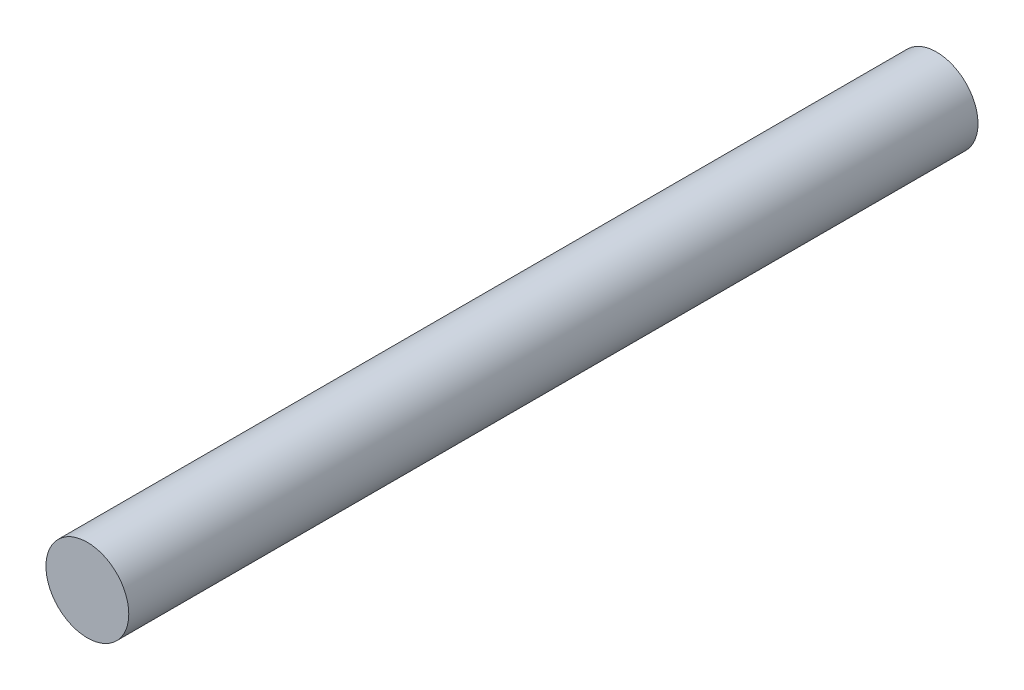
ISO-10303-21;
HEADER;
FILE_DESCRIPTION(('STEP AP214'),'2;1');
FILE_NAME('part.step','',(''),(''),'','','');
FILE_SCHEMA(('AUTOMOTIVE_DESIGN { 1 0 10303 214 1 1 1 1 }'));
ENDSEC;
DATA;
#1=APPLICATION_CONTEXT('core data for automotive mechanical design processes');
#2=APPLICATION_PROTOCOL_DEFINITION('international standard','automotive_design',2000,#1);
#3=PRODUCT_CONTEXT('',#1,'mechanical');
#4=PRODUCT('Part','Part','',(#3));
#5=PRODUCT_RELATED_PRODUCT_CATEGORY('part','',(#4));
#6=PRODUCT_DEFINITION_FORMATION('','',#4);
#7=PRODUCT_DEFINITION_CONTEXT('part definition',#1,'design');
#8=PRODUCT_DEFINITION('design','',#6,#7);
#9=PRODUCT_DEFINITION_SHAPE('','',#8);
#10=(LENGTH_UNIT() NAMED_UNIT(*) SI_UNIT(.MILLI.,.METRE.));
#11=(NAMED_UNIT(*) PLANE_ANGLE_UNIT() SI_UNIT($,.RADIAN.));
#12=(NAMED_UNIT(*) SI_UNIT($,.STERADIAN.) SOLID_ANGLE_UNIT());
#13=UNCERTAINTY_MEASURE_WITH_UNIT(LENGTH_MEASURE(1.E-05),#10,'distance_accuracy_value','');
#14=(GEOMETRIC_REPRESENTATION_CONTEXT(3) GLOBAL_UNCERTAINTY_ASSIGNED_CONTEXT((#13)) GLOBAL_UNIT_ASSIGNED_CONTEXT((#10,
#11,#12)) REPRESENTATION_CONTEXT('',''));
#15=CARTESIAN_POINT('',(0.,0.,0.));
#16=DIRECTION('',(0.,0.,1.));
#17=DIRECTION('',(1.,0.,0.));
#18=AXIS2_PLACEMENT_3D('',#15,#16,#17);
#19=CARTESIAN_POINT('',(0.,0.,82.));
#20=DIRECTION('',(0.,0.,-1.));
#21=DIRECTION('',(-1.,0.,0.));
#22=AXIS2_PLACEMENT_3D('',#19,#20,#21);
#23=CYLINDRICAL_SURFACE('',#22,4.);
#24=CARTESIAN_POINT('',(0.,0.,82.));
#25=DIRECTION('',(0.,0.,1.));
#26=DIRECTION('',(1.,0.,0.));
#27=AXIS2_PLACEMENT_3D('',#24,#25,#26);
#28=CIRCLE('',#27,4.);
#29=CARTESIAN_POINT('',(4.,0.,82.));
#30=VERTEX_POINT('',#29);
#31=EDGE_CURVE('E10',#30,#30,#28,.T.);
#32=ORIENTED_EDGE('',*,*,#31,.F.);
#33=EDGE_LOOP('',(#32));
#34=FACE_BOUND('',#33,.T.);
#35=CARTESIAN_POINT('',(0.,0.,0.));
#36=DIRECTION('',(0.,0.,1.));
#37=DIRECTION('',(1.,0.,0.));
#38=AXIS2_PLACEMENT_3D('',#35,#36,#37);
#39=CIRCLE('',#38,4.);
#40=CARTESIAN_POINT('',(4.,0.,0.));
#41=VERTEX_POINT('',#40);
#42=EDGE_CURVE('E34',#41,#41,#39,.T.);
#43=ORIENTED_EDGE('',*,*,#42,.T.);
#44=EDGE_LOOP('',(#43));
#45=FACE_BOUND('',#44,.T.);
#46=ADVANCED_FACE('F31',(#34,#45),#23,.T.);
#47=CARTESIAN_POINT('',(0.,0.,82.));
#48=DIRECTION('',(0.,0.,1.));
#49=DIRECTION('',(1.,0.,0.));
#50=AXIS2_PLACEMENT_3D('',#47,#48,#49);
#51=PLANE('',#50);
#52=ORIENTED_EDGE('',*,*,#31,.T.);
#53=EDGE_LOOP('',(#52));
#54=FACE_BOUND('',#53,.T.);
#55=ADVANCED_FACE('F46',(#54),#51,.T.);
#56=CARTESIAN_POINT('',(0.,0.,0.));
#57=DIRECTION('',(0.,0.,1.));
#58=DIRECTION('',(1.,0.,0.));
#59=AXIS2_PLACEMENT_3D('',#56,#57,#58);
#60=PLANE('',#59);
#61=ORIENTED_EDGE('',*,*,#42,.F.);
#62=EDGE_LOOP('',(#61));
#63=FACE_BOUND('',#62,.T.);
#64=ADVANCED_FACE('F44',(#63),#60,.F.);
#65=CLOSED_SHELL('',(#46,#55,#64));
#66=MANIFOLD_SOLID_BREP('B2',#65);
#67=ADVANCED_BREP_SHAPE_REPRESENTATION('',(#18,#66),#14);
#68=SHAPE_DEFINITION_REPRESENTATION(#9,#67);
ENDSEC;
END-ISO-10303-21;
